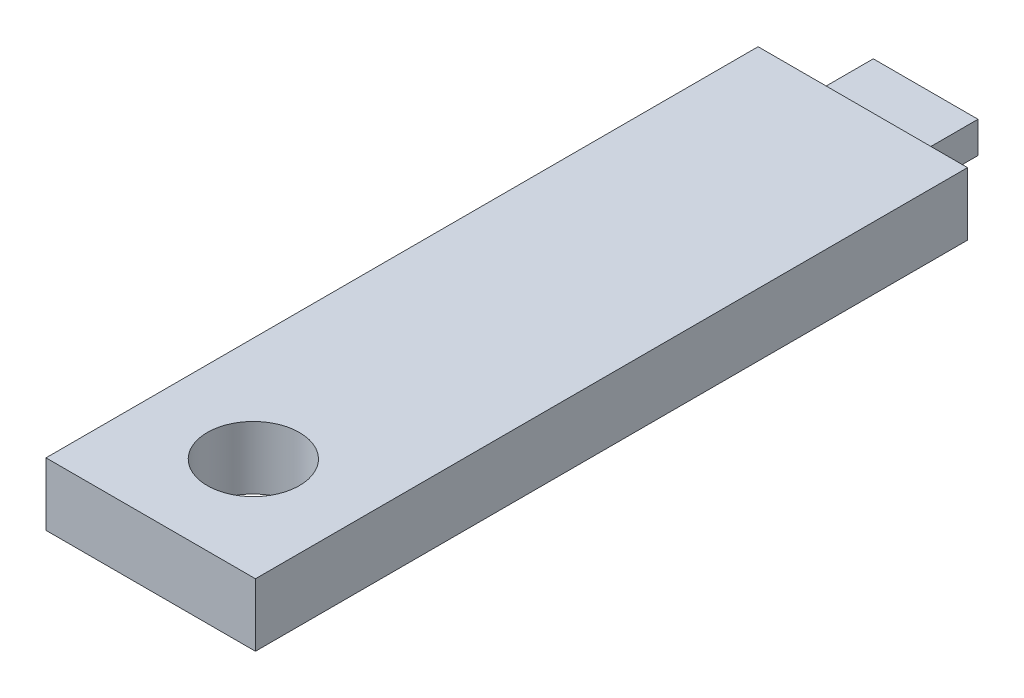
ISO-10303-21;
HEADER;
FILE_DESCRIPTION(('STEP AP214'),'2;1');
FILE_NAME('part.step','',(''),(''),'','','');
FILE_SCHEMA(('AUTOMOTIVE_DESIGN { 1 0 10303 214 1 1 1 1 }'));
ENDSEC;
DATA;
#1=APPLICATION_CONTEXT('core data for automotive mechanical design processes');
#2=APPLICATION_PROTOCOL_DEFINITION('international standard','automotive_design',2000,#1);
#3=PRODUCT_CONTEXT('',#1,'mechanical');
#4=PRODUCT('Part','Part','',(#3));
#5=PRODUCT_RELATED_PRODUCT_CATEGORY('part','',(#4));
#6=PRODUCT_DEFINITION_FORMATION('','',#4);
#7=PRODUCT_DEFINITION_CONTEXT('part definition',#1,'design');
#8=PRODUCT_DEFINITION('design','',#6,#7);
#9=PRODUCT_DEFINITION_SHAPE('','',#8);
#10=(LENGTH_UNIT() NAMED_UNIT(*) SI_UNIT(.MILLI.,.METRE.));
#11=(NAMED_UNIT(*) PLANE_ANGLE_UNIT() SI_UNIT($,.RADIAN.));
#12=(NAMED_UNIT(*) SI_UNIT($,.STERADIAN.) SOLID_ANGLE_UNIT());
#13=UNCERTAINTY_MEASURE_WITH_UNIT(LENGTH_MEASURE(1.E-05),#10,'distance_accuracy_value','');
#14=(GEOMETRIC_REPRESENTATION_CONTEXT(3) GLOBAL_UNCERTAINTY_ASSIGNED_CONTEXT((#13)) GLOBAL_UNIT_ASSIGNED_CONTEXT((#10,
#11,#12)) REPRESENTATION_CONTEXT('',''));
#15=CARTESIAN_POINT('',(0.,0.,0.));
#16=DIRECTION('',(0.,0.,1.));
#17=DIRECTION('',(1.,0.,0.));
#18=AXIS2_PLACEMENT_3D('',#15,#16,#17);
#19=CARTESIAN_POINT('',(0.,0.,3.));
#20=DIRECTION('',(1.,0.,0.));
#21=DIRECTION('',(0.,0.,-1.));
#22=AXIS2_PLACEMENT_3D('',#19,#20,#21);
#23=PLANE('',#22);
#24=DIRECTION('',(0.,-1.,0.));
#25=VECTOR('',#24,1.);
#26=CARTESIAN_POINT('',(0.,0.,0.));
#27=LINE('',#26,#25);
#28=CARTESIAN_POINT('',(0.,1.5,0.));
#29=VERTEX_POINT('',#28);
#30=CARTESIAN_POINT('',(0.,0.,0.));
#31=VERTEX_POINT('',#30);
#32=EDGE_CURVE('E147',#29,#31,#27,.T.);
#33=ORIENTED_EDGE('',*,*,#32,.T.);
#34=DIRECTION('',(0.,0.,-1.));
#35=VECTOR('',#34,1.);
#36=CARTESIAN_POINT('',(0.,0.,3.));
#37=LINE('',#36,#35);
#38=CARTESIAN_POINT('',(0.,0.,3.));
#39=VERTEX_POINT('',#38);
#40=EDGE_CURVE('E11',#39,#31,#37,.T.);
#41=ORIENTED_EDGE('',*,*,#40,.F.);
#42=DIRECTION('',(0.,-1.,0.));
#43=VECTOR('',#42,1.);
#44=CARTESIAN_POINT('',(0.,0.,3.));
#45=LINE('',#44,#43);
#46=CARTESIAN_POINT('',(0.,1.5,3.));
#47=VERTEX_POINT('',#46);
#48=EDGE_CURVE('E156',#47,#39,#45,.T.);
#49=ORIENTED_EDGE('',*,*,#48,.F.);
#50=DIRECTION('',(0.,0.,-1.));
#51=VECTOR('',#50,1.);
#52=CARTESIAN_POINT('',(0.,1.5,3.));
#53=LINE('',#52,#51);
#54=EDGE_CURVE('E165',#47,#29,#53,.T.);
#55=ORIENTED_EDGE('',*,*,#54,.T.);
#56=EDGE_LOOP('',(#33,#41,#49,#55));
#57=FACE_BOUND('',#56,.T.);
#58=ADVANCED_FACE('F49',(#57),#23,.F.);
#59=CARTESIAN_POINT('',(0.,0.,3.));
#60=DIRECTION('',(0.,1.,0.));
#61=DIRECTION('',(0.,0.,1.));
#62=AXIS2_PLACEMENT_3D('',#59,#60,#61);
#63=PLANE('',#62);
#64=DIRECTION('',(1.,0.,0.));
#65=VECTOR('',#64,1.);
#66=CARTESIAN_POINT('',(0.,0.,0.));
#67=LINE('',#66,#65);
#68=CARTESIAN_POINT('',(5.,0.,0.));
#69=VERTEX_POINT('',#68);
#70=EDGE_CURVE('E150',#31,#69,#67,.T.);
#71=ORIENTED_EDGE('',*,*,#70,.T.);
#72=DIRECTION('',(0.,0.,-1.));
#73=VECTOR('',#72,1.);
#74=CARTESIAN_POINT('',(5.,0.,3.));
#75=LINE('',#74,#73);
#76=CARTESIAN_POINT('',(5.,0.,3.));
#77=VERTEX_POINT('',#76);
#78=EDGE_CURVE('E57',#77,#69,#75,.T.);
#79=ORIENTED_EDGE('',*,*,#78,.F.);
#80=DIRECTION('',(1.,0.,0.));
#81=VECTOR('',#80,1.);
#82=CARTESIAN_POINT('',(0.,0.,3.));
#83=LINE('',#82,#81);
#84=EDGE_CURVE('E91',#39,#77,#83,.T.);
#85=ORIENTED_EDGE('',*,*,#84,.F.);
#86=ORIENTED_EDGE('',*,*,#40,.T.);
#87=EDGE_LOOP('',(#71,#79,#85,#86));
#88=FACE_BOUND('',#87,.T.);
#89=ADVANCED_FACE('F220',(#88),#63,.F.);
#90=CARTESIAN_POINT('',(5.,0.,3.));
#91=DIRECTION('',(-1.,0.,0.));
#92=DIRECTION('',(0.,0.,1.));
#93=AXIS2_PLACEMENT_3D('',#90,#91,#92);
#94=PLANE('',#93);
#95=DIRECTION('',(0.,1.,0.));
#96=VECTOR('',#95,1.);
#97=CARTESIAN_POINT('',(5.,0.,0.));
#98=LINE('',#97,#96);
#99=CARTESIAN_POINT('',(5.,1.5,0.));
#100=VERTEX_POINT('',#99);
#101=EDGE_CURVE('E81',#69,#100,#98,.T.);
#102=ORIENTED_EDGE('',*,*,#101,.T.);
#103=DIRECTION('',(0.,0.,-1.));
#104=VECTOR('',#103,1.);
#105=CARTESIAN_POINT('',(5.,1.5,3.));
#106=LINE('',#105,#104);
#107=CARTESIAN_POINT('',(5.,1.5,3.));
#108=VERTEX_POINT('',#107);
#109=EDGE_CURVE('E65',#108,#100,#106,.T.);
#110=ORIENTED_EDGE('',*,*,#109,.F.);
#111=DIRECTION('',(0.,1.,0.));
#112=VECTOR('',#111,1.);
#113=CARTESIAN_POINT('',(5.,0.,3.));
#114=LINE('',#113,#112);
#115=EDGE_CURVE('E160',#77,#108,#114,.T.);
#116=ORIENTED_EDGE('',*,*,#115,.F.);
#117=ORIENTED_EDGE('',*,*,#78,.T.);
#118=EDGE_LOOP('',(#102,#110,#116,#117));
#119=FACE_BOUND('',#118,.T.);
#120=ADVANCED_FACE('F171',(#119),#94,.F.);
#121=CARTESIAN_POINT('',(0.,1.5,3.));
#122=DIRECTION('',(0.,-1.,0.));
#123=DIRECTION('',(0.,0.,-1.));
#124=AXIS2_PLACEMENT_3D('',#121,#122,#123);
#125=PLANE('',#124);
#126=DIRECTION('',(-1.,0.,0.));
#127=VECTOR('',#126,1.);
#128=CARTESIAN_POINT('',(0.,1.5,0.));
#129=LINE('',#128,#127);
#130=EDGE_CURVE('E86',#100,#29,#129,.T.);
#131=ORIENTED_EDGE('',*,*,#130,.T.);
#132=ORIENTED_EDGE('',*,*,#54,.F.);
#133=DIRECTION('',(-1.,0.,0.));
#134=VECTOR('',#133,1.);
#135=CARTESIAN_POINT('',(0.,1.5,3.));
#136=LINE('',#135,#134);
#137=EDGE_CURVE('E163',#108,#47,#136,.T.);
#138=ORIENTED_EDGE('',*,*,#137,.F.);
#139=ORIENTED_EDGE('',*,*,#109,.T.);
#140=EDGE_LOOP('',(#131,#132,#138,#139));
#141=FACE_BOUND('',#140,.T.);
#142=ADVANCED_FACE('F176',(#141),#125,.F.);
#143=CARTESIAN_POINT('',(0.,0.,0.));
#144=DIRECTION('',(0.,0.,-1.));
#145=DIRECTION('',(-1.,0.,0.));
#146=AXIS2_PLACEMENT_3D('',#143,#144,#145);
#147=PLANE('',#146);
#148=ORIENTED_EDGE('',*,*,#32,.F.);
#149=ORIENTED_EDGE('',*,*,#130,.F.);
#150=ORIENTED_EDGE('',*,*,#101,.F.);
#151=ORIENTED_EDGE('',*,*,#70,.F.);
#152=EDGE_LOOP('',(#148,#149,#150,#151));
#153=FACE_BOUND('',#152,.T.);
#154=ADVANCED_FACE('F174',(#153),#147,.T.);
#155=CARTESIAN_POINT('',(-2.5,-0.75,37.));
#156=DIRECTION('',(1.,0.,0.));
#157=DIRECTION('',(0.,0.,-1.));
#158=AXIS2_PLACEMENT_3D('',#155,#156,#157);
#159=PLANE('',#158);
#160=DIRECTION('',(0.,-1.,0.));
#161=VECTOR('',#160,1.);
#162=CARTESIAN_POINT('',(-2.5,-0.75,3.));
#163=LINE('',#162,#161);
#164=CARTESIAN_POINT('',(-2.5,2.25,3.));
#165=VERTEX_POINT('',#164);
#166=CARTESIAN_POINT('',(-2.5,-0.75,3.));
#167=VERTEX_POINT('',#166);
#168=EDGE_CURVE('E146',#165,#167,#163,.T.);
#169=ORIENTED_EDGE('',*,*,#168,.T.);
#170=DIRECTION('',(0.,0.,-1.));
#171=VECTOR('',#170,1.);
#172=CARTESIAN_POINT('',(-2.5,-0.75,37.));
#173=LINE('',#172,#171);
#174=CARTESIAN_POINT('',(-2.5,-0.75,37.));
#175=VERTEX_POINT('',#174);
#176=EDGE_CURVE('E126',#175,#167,#173,.T.);
#177=ORIENTED_EDGE('',*,*,#176,.F.);
#178=DIRECTION('',(0.,-1.,0.));
#179=VECTOR('',#178,1.);
#180=CARTESIAN_POINT('',(-2.5,-0.75,37.));
#181=LINE('',#180,#179);
#182=CARTESIAN_POINT('',(-2.5,2.25,37.));
#183=VERTEX_POINT('',#182);
#184=EDGE_CURVE('E133',#183,#175,#181,.T.);
#185=ORIENTED_EDGE('',*,*,#184,.F.);
#186=DIRECTION('',(0.,0.,-1.));
#187=VECTOR('',#186,1.);
#188=CARTESIAN_POINT('',(-2.5,2.25,37.));
#189=LINE('',#188,#187);
#190=EDGE_CURVE('E198',#183,#165,#189,.T.);
#191=ORIENTED_EDGE('',*,*,#190,.T.);
#192=EDGE_LOOP('',(#169,#177,#185,#191));
#193=FACE_BOUND('',#192,.T.);
#194=ADVANCED_FACE('F144',(#193),#159,.F.);
#195=CARTESIAN_POINT('',(-2.5,-0.75,37.));
#196=DIRECTION('',(0.,1.,0.));
#197=DIRECTION('',(0.,0.,1.));
#198=AXIS2_PLACEMENT_3D('',#195,#196,#197);
#199=PLANE('',#198);
#200=CARTESIAN_POINT('',(2.49999999999975,-0.75,32.1000000000002));
#201=DIRECTION('',(0.,-1.,0.));
#202=DIRECTION('',(0.,0.,-1.));
#203=AXIS2_PLACEMENT_3D('',#200,#201,#202);
#204=CIRCLE('',#203,2.2);
#205=CARTESIAN_POINT('',(2.49999999999975,-0.75,29.9000000000001));
#206=VERTEX_POINT('',#205);
#207=EDGE_CURVE('E191',#206,#206,#204,.T.);
#208=ORIENTED_EDGE('',*,*,#207,.F.);
#209=EDGE_LOOP('',(#208));
#210=FACE_BOUND('',#209,.T.);
#211=DIRECTION('',(1.,0.,0.));
#212=VECTOR('',#211,1.);
#213=CARTESIAN_POINT('',(-2.5,-0.75,3.));
#214=LINE('',#213,#212);
#215=CARTESIAN_POINT('',(7.5,-0.75,3.));
#216=VERTEX_POINT('',#215);
#217=EDGE_CURVE('E185',#167,#216,#214,.T.);
#218=ORIENTED_EDGE('',*,*,#217,.T.);
#219=DIRECTION('',(0.,0.,-1.));
#220=VECTOR('',#219,1.);
#221=CARTESIAN_POINT('',(7.5,-0.75,37.));
#222=LINE('',#221,#220);
#223=CARTESIAN_POINT('',(7.5,-0.75,37.));
#224=VERTEX_POINT('',#223);
#225=EDGE_CURVE('E129',#224,#216,#222,.T.);
#226=ORIENTED_EDGE('',*,*,#225,.F.);
#227=DIRECTION('',(1.,0.,0.));
#228=VECTOR('',#227,1.);
#229=CARTESIAN_POINT('',(-2.5,-0.75,37.));
#230=LINE('',#229,#228);
#231=EDGE_CURVE('E122',#175,#224,#230,.T.);
#232=ORIENTED_EDGE('',*,*,#231,.F.);
#233=ORIENTED_EDGE('',*,*,#176,.T.);
#234=EDGE_LOOP('',(#218,#226,#232,#233));
#235=FACE_BOUND('',#234,.T.);
#236=ADVANCED_FACE('F124',(#210,#235),#199,.F.);
#237=CARTESIAN_POINT('',(7.5,-0.75,37.));
#238=DIRECTION('',(-1.,0.,0.));
#239=DIRECTION('',(0.,0.,1.));
#240=AXIS2_PLACEMENT_3D('',#237,#238,#239);
#241=PLANE('',#240);
#242=DIRECTION('',(0.,1.,0.));
#243=VECTOR('',#242,1.);
#244=CARTESIAN_POINT('',(7.5,-0.75,3.));
#245=LINE('',#244,#243);
#246=CARTESIAN_POINT('',(7.5,2.25,3.));
#247=VERTEX_POINT('',#246);
#248=EDGE_CURVE('E188',#216,#247,#245,.T.);
#249=ORIENTED_EDGE('',*,*,#248,.T.);
#250=DIRECTION('',(0.,0.,-1.));
#251=VECTOR('',#250,1.);
#252=CARTESIAN_POINT('',(7.5,2.25,37.));
#253=LINE('',#252,#251);
#254=CARTESIAN_POINT('',(7.5,2.25,37.));
#255=VERTEX_POINT('',#254);
#256=EDGE_CURVE('E152',#255,#247,#253,.T.);
#257=ORIENTED_EDGE('',*,*,#256,.F.);
#258=DIRECTION('',(0.,1.,0.));
#259=VECTOR('',#258,1.);
#260=CARTESIAN_POINT('',(7.5,-0.75,37.));
#261=LINE('',#260,#259);
#262=EDGE_CURVE('E132',#224,#255,#261,.T.);
#263=ORIENTED_EDGE('',*,*,#262,.F.);
#264=ORIENTED_EDGE('',*,*,#225,.T.);
#265=EDGE_LOOP('',(#249,#257,#263,#264));
#266=FACE_BOUND('',#265,.T.);
#267=ADVANCED_FACE('F204',(#266),#241,.F.);
#268=CARTESIAN_POINT('',(-2.5,2.25,37.));
#269=DIRECTION('',(0.,-1.,0.));
#270=DIRECTION('',(0.,0.,-1.));
#271=AXIS2_PLACEMENT_3D('',#268,#269,#270);
#272=PLANE('',#271);
#273=CARTESIAN_POINT('',(2.49999999999975,2.25,32.1000000000002));
#274=DIRECTION('',(0.,-1.,0.));
#275=DIRECTION('',(0.,0.,-1.));
#276=AXIS2_PLACEMENT_3D('',#273,#274,#275);
#277=CIRCLE('',#276,2.2);
#278=CARTESIAN_POINT('',(2.49999999999975,2.25,29.9000000000001));
#279=VERTEX_POINT('',#278);
#280=EDGE_CURVE('E186',#279,#279,#277,.T.);
#281=ORIENTED_EDGE('',*,*,#280,.T.);
#282=EDGE_LOOP('',(#281));
#283=FACE_BOUND('',#282,.T.);
#284=DIRECTION('',(-1.,0.,0.));
#285=VECTOR('',#284,1.);
#286=CARTESIAN_POINT('',(-2.5,2.25,3.));
#287=LINE('',#286,#285);
#288=EDGE_CURVE('E142',#247,#165,#287,.T.);
#289=ORIENTED_EDGE('',*,*,#288,.T.);
#290=ORIENTED_EDGE('',*,*,#190,.F.);
#291=DIRECTION('',(-1.,0.,0.));
#292=VECTOR('',#291,1.);
#293=CARTESIAN_POINT('',(-2.5,2.25,37.));
#294=LINE('',#293,#292);
#295=EDGE_CURVE('E138',#255,#183,#294,.T.);
#296=ORIENTED_EDGE('',*,*,#295,.F.);
#297=ORIENTED_EDGE('',*,*,#256,.T.);
#298=EDGE_LOOP('',(#289,#290,#296,#297));
#299=FACE_BOUND('',#298,.T.);
#300=ADVANCED_FACE('F202',(#283,#299),#272,.F.);
#301=CARTESIAN_POINT('',(0.,0.,37.));
#302=DIRECTION('',(0.,0.,-1.));
#303=DIRECTION('',(-1.,0.,0.));
#304=AXIS2_PLACEMENT_3D('',#301,#302,#303);
#305=PLANE('',#304);
#306=ORIENTED_EDGE('',*,*,#184,.T.);
#307=ORIENTED_EDGE('',*,*,#231,.T.);
#308=ORIENTED_EDGE('',*,*,#262,.T.);
#309=ORIENTED_EDGE('',*,*,#295,.T.);
#310=EDGE_LOOP('',(#306,#307,#308,#309));
#311=FACE_BOUND('',#310,.T.);
#312=ADVANCED_FACE('F136',(#311),#305,.F.);
#313=CARTESIAN_POINT('',(0.,0.,3.));
#314=DIRECTION('',(0.,0.,-1.));
#315=DIRECTION('',(-1.,0.,0.));
#316=AXIS2_PLACEMENT_3D('',#313,#314,#315);
#317=PLANE('',#316);
#318=ORIENTED_EDGE('',*,*,#137,.T.);
#319=ORIENTED_EDGE('',*,*,#48,.T.);
#320=ORIENTED_EDGE('',*,*,#84,.T.);
#321=ORIENTED_EDGE('',*,*,#115,.T.);
#322=EDGE_LOOP('',(#318,#319,#320,#321));
#323=FACE_BOUND('',#322,.T.);
#324=ORIENTED_EDGE('',*,*,#168,.F.);
#325=ORIENTED_EDGE('',*,*,#288,.F.);
#326=ORIENTED_EDGE('',*,*,#248,.F.);
#327=ORIENTED_EDGE('',*,*,#217,.F.);
#328=EDGE_LOOP('',(#324,#325,#326,#327));
#329=FACE_BOUND('',#328,.T.);
#330=ADVANCED_FACE('F178',(#323,#329),#317,.T.);
#331=CARTESIAN_POINT('',(2.49999999999975,2.25,32.1000000000002));
#332=DIRECTION('',(0.,-1.,0.));
#333=DIRECTION('',(0.,0.,-1.));
#334=AXIS2_PLACEMENT_3D('',#331,#332,#333);
#335=CYLINDRICAL_SURFACE('',#334,2.2);
#336=ORIENTED_EDGE('',*,*,#280,.F.);
#337=EDGE_LOOP('',(#336));
#338=FACE_BOUND('',#337,.T.);
#339=ORIENTED_EDGE('',*,*,#207,.T.);
#340=EDGE_LOOP('',(#339));
#341=FACE_BOUND('',#340,.T.);
#342=ADVANCED_FACE('F181',(#338,#341),#335,.F.);
#343=CLOSED_SHELL('',(#58,#89,#120,#142,#154,#194,#236,#267,#300,#312,#330,#342));
#344=MANIFOLD_SOLID_BREP('B2',#343);
#345=ADVANCED_BREP_SHAPE_REPRESENTATION('',(#18,#344),#14);
#346=SHAPE_DEFINITION_REPRESENTATION(#9,#345);
ENDSEC;
END-ISO-10303-21;
